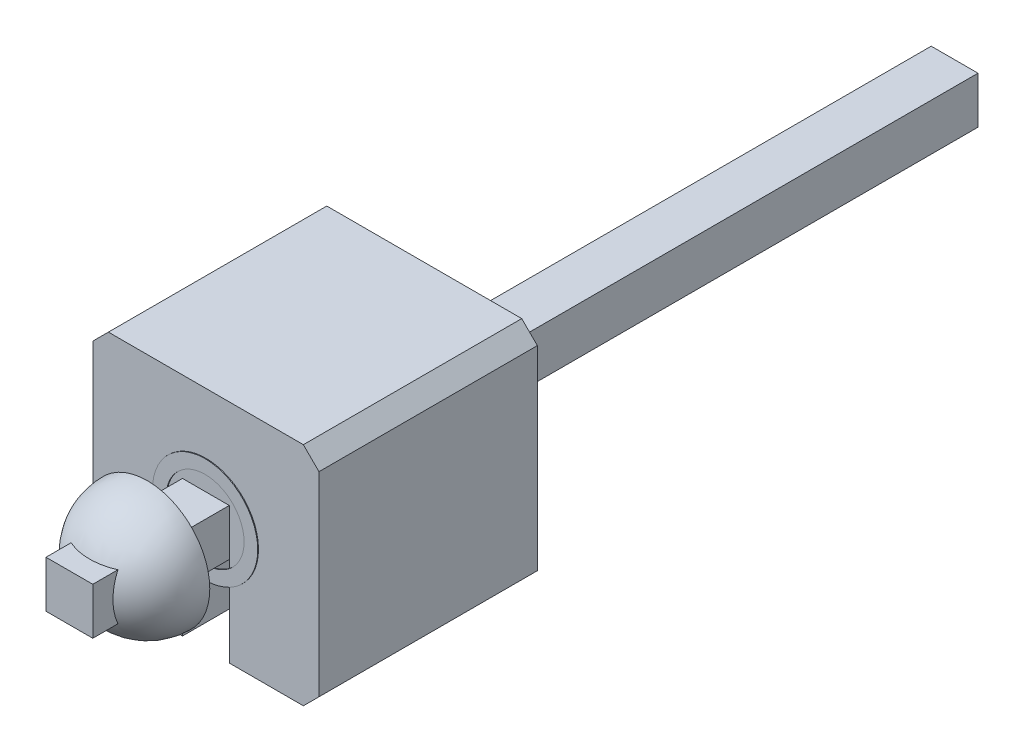
ISO-10303-21;
HEADER;
FILE_DESCRIPTION(('STEP AP214'),'2;1');
FILE_NAME('part.step','',(''),(''),'','','');
FILE_SCHEMA(('AUTOMOTIVE_DESIGN { 1 0 10303 214 1 1 1 1 }'));
ENDSEC;
DATA;
#1=APPLICATION_CONTEXT('core data for automotive mechanical design processes');
#2=APPLICATION_PROTOCOL_DEFINITION('international standard','automotive_design',2000,#1);
#3=PRODUCT_CONTEXT('',#1,'mechanical');
#4=PRODUCT('Part','Part','',(#3));
#5=PRODUCT_RELATED_PRODUCT_CATEGORY('part','',(#4));
#6=PRODUCT_DEFINITION_FORMATION('','',#4);
#7=PRODUCT_DEFINITION_CONTEXT('part definition',#1,'design');
#8=PRODUCT_DEFINITION('design','',#6,#7);
#9=PRODUCT_DEFINITION_SHAPE('','',#8);
#10=(LENGTH_UNIT() NAMED_UNIT(*) SI_UNIT(.MILLI.,.METRE.));
#11=(NAMED_UNIT(*) PLANE_ANGLE_UNIT() SI_UNIT($,.RADIAN.));
#12=(NAMED_UNIT(*) SI_UNIT($,.STERADIAN.) SOLID_ANGLE_UNIT());
#13=UNCERTAINTY_MEASURE_WITH_UNIT(LENGTH_MEASURE(1.E-05),#10,'distance_accuracy_value','');
#14=(GEOMETRIC_REPRESENTATION_CONTEXT(3) GLOBAL_UNCERTAINTY_ASSIGNED_CONTEXT((#13)) GLOBAL_UNIT_ASSIGNED_CONTEXT((#10,
#11,#12)) REPRESENTATION_CONTEXT('',''));
#15=CARTESIAN_POINT('',(0.,0.,0.));
#16=DIRECTION('',(0.,0.,1.));
#17=DIRECTION('',(1.,0.,0.));
#18=AXIS2_PLACEMENT_3D('',#15,#16,#17);
#19=CARTESIAN_POINT('',(0.,0.,2.8));
#20=DIRECTION('',(0.,0.,-1.));
#21=DIRECTION('',(-1.,0.,0.));
#22=AXIS2_PLACEMENT_3D('',#19,#20,#21);
#23=PLANE('',#22);
#24=DIRECTION('',(0.,1.,0.));
#25=VECTOR('',#24,1.);
#26=CARTESIAN_POINT('',(0.3,0.3,2.8));
#27=LINE('',#26,#25);
#28=CARTESIAN_POINT('',(0.3,-0.4,2.8));
#29=VERTEX_POINT('',#28);
#30=CARTESIAN_POINT('',(0.3,-0.3,2.8));
#31=VERTEX_POINT('',#30);
#32=EDGE_CURVE('E325',#29,#31,#27,.T.);
#33=ORIENTED_EDGE('',*,*,#32,.F.);
#34=CARTESIAN_POINT('',(0.,0.,2.8));
#35=DIRECTION('',(0.,0.,1.));
#36=DIRECTION('',(1.,0.,0.));
#37=AXIS2_PLACEMENT_3D('',#34,#35,#36);
#38=CIRCLE('',#37,0.5);
#39=CARTESIAN_POINT('',(-0.3,-0.4,2.8));
#40=VERTEX_POINT('',#39);
#41=EDGE_CURVE('E257',#29,#40,#38,.T.);
#42=ORIENTED_EDGE('',*,*,#41,.T.);
#43=DIRECTION('',(0.,-1.,0.));
#44=VECTOR('',#43,1.);
#45=CARTESIAN_POINT('',(-0.3,0.3,2.8));
#46=LINE('',#45,#44);
#47=CARTESIAN_POINT('',(-0.3,-0.3,2.8));
#48=VERTEX_POINT('',#47);
#49=EDGE_CURVE('E331',#48,#40,#46,.T.);
#50=ORIENTED_EDGE('',*,*,#49,.F.);
#51=CARTESIAN_POINT('',(-0.3,0.3,2.8));
#52=VERTEX_POINT('',#51);
#53=EDGE_CURVE('E328',#52,#48,#46,.T.);
#54=ORIENTED_EDGE('',*,*,#53,.F.);
#55=DIRECTION('',(-1.,0.,0.));
#56=VECTOR('',#55,1.);
#57=CARTESIAN_POINT('',(-0.3,0.3,2.8));
#58=LINE('',#57,#56);
#59=CARTESIAN_POINT('',(0.3,0.3,2.8));
#60=VERTEX_POINT('',#59);
#61=EDGE_CURVE('E324',#60,#52,#58,.T.);
#62=ORIENTED_EDGE('',*,*,#61,.F.);
#63=DIRECTION('',(0.,-1.,0.));
#64=VECTOR('',#63,1.);
#65=CARTESIAN_POINT('',(0.3,0.,2.8));
#66=LINE('',#65,#64);
#67=EDGE_CURVE('E288',#60,#31,#66,.T.);
#68=ORIENTED_EDGE('',*,*,#67,.T.);
#69=EDGE_LOOP('',(#33,#42,#50,#54,#62,#68));
#70=FACE_BOUND('',#69,.T.);
#71=ADVANCED_FACE('F34',(#70),#23,.F.);
#72=CARTESIAN_POINT('',(0.,0.,2.8));
#73=DIRECTION('',(0.,0.,1.));
#74=DIRECTION('',(1.,0.,0.));
#75=AXIS2_PLACEMENT_3D('',#72,#73,#74);
#76=CIRCLE('',#75,0.674645204944682);
#77=CARTESIAN_POINT('',(0.3,-0.604273243288872,2.8));
#78=VERTEX_POINT('',#77);
#79=CARTESIAN_POINT('',(-0.3,-0.604273243288872,2.8));
#80=VERTEX_POINT('',#79);
#81=EDGE_CURVE('E261',#78,#80,#76,.T.);
#82=ORIENTED_EDGE('',*,*,#81,.F.);
#83=CARTESIAN_POINT('',(0.3,-1.45,2.8));
#84=VERTEX_POINT('',#83);
#85=EDGE_CURVE('E321',#84,#78,#27,.T.);
#86=ORIENTED_EDGE('',*,*,#85,.F.);
#87=DIRECTION('',(1.,0.,0.));
#88=VECTOR('',#87,1.);
#89=CARTESIAN_POINT('',(1.25,-1.45,2.8));
#90=LINE('',#89,#88);
#91=CARTESIAN_POINT('',(1.25,-1.45,2.8));
#92=VERTEX_POINT('',#91);
#93=EDGE_CURVE('E353',#84,#92,#90,.T.);
#94=ORIENTED_EDGE('',*,*,#93,.T.);
#95=DIRECTION('',(0.707106781186548,0.707106781186548,0.));
#96=VECTOR('',#95,1.);
#97=CARTESIAN_POINT('',(1.45,-1.25,2.8));
#98=LINE('',#97,#96);
#99=CARTESIAN_POINT('',(1.45,-1.25,2.8));
#100=VERTEX_POINT('',#99);
#101=EDGE_CURVE('E357',#92,#100,#98,.T.);
#102=ORIENTED_EDGE('',*,*,#101,.T.);
#103=DIRECTION('',(0.,1.,0.));
#104=VECTOR('',#103,1.);
#105=CARTESIAN_POINT('',(1.45,-1.25,2.8));
#106=LINE('',#105,#104);
#107=CARTESIAN_POINT('',(1.45,1.25,2.8));
#108=VERTEX_POINT('',#107);
#109=EDGE_CURVE('E359',#100,#108,#106,.T.);
#110=ORIENTED_EDGE('',*,*,#109,.T.);
#111=DIRECTION('',(-0.707106781186548,0.707106781186548,0.));
#112=VECTOR('',#111,1.);
#113=CARTESIAN_POINT('',(1.45,1.25,2.8));
#114=LINE('',#113,#112);
#115=CARTESIAN_POINT('',(1.25,1.45,2.8));
#116=VERTEX_POINT('',#115);
#117=EDGE_CURVE('E361',#108,#116,#114,.T.);
#118=ORIENTED_EDGE('',*,*,#117,.T.);
#119=DIRECTION('',(-1.,0.,0.));
#120=VECTOR('',#119,1.);
#121=CARTESIAN_POINT('',(1.25,1.45,2.8));
#122=LINE('',#121,#120);
#123=CARTESIAN_POINT('',(-1.25,1.45,2.8));
#124=VERTEX_POINT('',#123);
#125=EDGE_CURVE('E343',#116,#124,#122,.T.);
#126=ORIENTED_EDGE('',*,*,#125,.T.);
#127=DIRECTION('',(-0.707106781186547,-0.707106781186548,0.));
#128=VECTOR('',#127,1.);
#129=CARTESIAN_POINT('',(-1.25,1.45,2.8));
#130=LINE('',#129,#128);
#131=CARTESIAN_POINT('',(-1.45,1.25,2.8));
#132=VERTEX_POINT('',#131);
#133=EDGE_CURVE('E346',#124,#132,#130,.T.);
#134=ORIENTED_EDGE('',*,*,#133,.T.);
#135=DIRECTION('',(0.,-1.,0.));
#136=VECTOR('',#135,1.);
#137=CARTESIAN_POINT('',(-1.45,-1.25,2.8));
#138=LINE('',#137,#136);
#139=CARTESIAN_POINT('',(-1.45,-1.25,2.8));
#140=VERTEX_POINT('',#139);
#141=EDGE_CURVE('E349',#132,#140,#138,.T.);
#142=ORIENTED_EDGE('',*,*,#141,.T.);
#143=DIRECTION('',(0.707106781186548,-0.707106781186548,0.));
#144=VECTOR('',#143,1.);
#145=CARTESIAN_POINT('',(-1.25,-1.45,2.8));
#146=LINE('',#145,#144);
#147=CARTESIAN_POINT('',(-1.25,-1.45,2.8));
#148=VERTEX_POINT('',#147);
#149=EDGE_CURVE('E351',#140,#148,#146,.T.);
#150=ORIENTED_EDGE('',*,*,#149,.T.);
#151=CARTESIAN_POINT('',(-0.3,-1.45,2.8));
#152=VERTEX_POINT('',#151);
#153=EDGE_CURVE('E354',#148,#152,#90,.T.);
#154=ORIENTED_EDGE('',*,*,#153,.T.);
#155=EDGE_CURVE('E327',#80,#152,#46,.T.);
#156=ORIENTED_EDGE('',*,*,#155,.F.);
#157=EDGE_LOOP('',(#82,#86,#94,#102,#110,#118,#126,#134,#142,#150,#154,#156));
#158=FACE_BOUND('',#157,.T.);
#159=ADVANCED_FACE('F478',(#158),#23,.F.);
#160=CARTESIAN_POINT('',(0.,0.,0.));
#161=DIRECTION('',(0.,0.,-1.));
#162=DIRECTION('',(-1.,0.,0.));
#163=AXIS2_PLACEMENT_3D('',#160,#161,#162);
#164=PLANE('',#163);
#165=DIRECTION('',(-1.,0.,0.));
#166=VECTOR('',#165,1.);
#167=CARTESIAN_POINT('',(1.25,1.45,0.));
#168=LINE('',#167,#166);
#169=CARTESIAN_POINT('',(1.25,1.45,0.));
#170=VERTEX_POINT('',#169);
#171=CARTESIAN_POINT('',(-1.25,1.45,0.));
#172=VERTEX_POINT('',#171);
#173=EDGE_CURVE('E330',#170,#172,#168,.T.);
#174=ORIENTED_EDGE('',*,*,#173,.F.);
#175=DIRECTION('',(-0.707106781186548,0.707106781186548,0.));
#176=VECTOR('',#175,1.);
#177=CARTESIAN_POINT('',(1.45,1.25,0.));
#178=LINE('',#177,#176);
#179=CARTESIAN_POINT('',(1.45,1.25,0.));
#180=VERTEX_POINT('',#179);
#181=EDGE_CURVE('E347',#180,#170,#178,.T.);
#182=ORIENTED_EDGE('',*,*,#181,.F.);
#183=DIRECTION('',(0.,1.,0.));
#184=VECTOR('',#183,1.);
#185=CARTESIAN_POINT('',(1.45,-1.25,0.));
#186=LINE('',#185,#184);
#187=CARTESIAN_POINT('',(1.45,-1.25,0.));
#188=VERTEX_POINT('',#187);
#189=EDGE_CURVE('E376',#188,#180,#186,.T.);
#190=ORIENTED_EDGE('',*,*,#189,.F.);
#191=DIRECTION('',(0.707106781186548,0.707106781186548,0.));
#192=VECTOR('',#191,1.);
#193=CARTESIAN_POINT('',(1.45,-1.25,0.));
#194=LINE('',#193,#192);
#195=CARTESIAN_POINT('',(1.25,-1.45,0.));
#196=VERTEX_POINT('',#195);
#197=EDGE_CURVE('E374',#196,#188,#194,.T.);
#198=ORIENTED_EDGE('',*,*,#197,.F.);
#199=DIRECTION('',(1.,0.,0.));
#200=VECTOR('',#199,1.);
#201=CARTESIAN_POINT('',(1.25,-1.45,0.));
#202=LINE('',#201,#200);
#203=CARTESIAN_POINT('',(-1.25,-1.45,0.));
#204=VERTEX_POINT('',#203);
#205=EDGE_CURVE('E372',#204,#196,#202,.T.);
#206=ORIENTED_EDGE('',*,*,#205,.F.);
#207=DIRECTION('',(0.707106781186548,-0.707106781186548,0.));
#208=VECTOR('',#207,1.);
#209=CARTESIAN_POINT('',(-1.25,-1.45,0.));
#210=LINE('',#209,#208);
#211=CARTESIAN_POINT('',(-1.45,-1.25,0.));
#212=VERTEX_POINT('',#211);
#213=EDGE_CURVE('E370',#212,#204,#210,.T.);
#214=ORIENTED_EDGE('',*,*,#213,.F.);
#215=DIRECTION('',(0.,-1.,0.));
#216=VECTOR('',#215,1.);
#217=CARTESIAN_POINT('',(-1.45,-1.25,0.));
#218=LINE('',#217,#216);
#219=CARTESIAN_POINT('',(-1.45,1.25,0.));
#220=VERTEX_POINT('',#219);
#221=EDGE_CURVE('E368',#220,#212,#218,.T.);
#222=ORIENTED_EDGE('',*,*,#221,.F.);
#223=DIRECTION('',(-0.707106781186547,-0.707106781186548,0.));
#224=VECTOR('',#223,1.);
#225=CARTESIAN_POINT('',(-1.25,1.45,0.));
#226=LINE('',#225,#224);
#227=EDGE_CURVE('E366',#172,#220,#226,.T.);
#228=ORIENTED_EDGE('',*,*,#227,.F.);
#229=EDGE_LOOP('',(#174,#182,#190,#198,#206,#214,#222,#228));
#230=FACE_BOUND('',#229,.T.);
#231=DIRECTION('',(1.,0.,0.));
#232=VECTOR('',#231,1.);
#233=CARTESIAN_POINT('',(-0.3,-0.3,0.));
#234=LINE('',#233,#232);
#235=CARTESIAN_POINT('',(-0.3,-0.3,0.));
#236=VERTEX_POINT('',#235);
#237=CARTESIAN_POINT('',(0.3,-0.3,0.));
#238=VERTEX_POINT('',#237);
#239=EDGE_CURVE('E340',#236,#238,#234,.T.);
#240=ORIENTED_EDGE('',*,*,#239,.T.);
#241=DIRECTION('',(0.,1.,0.));
#242=VECTOR('',#241,1.);
#243=CARTESIAN_POINT('',(0.3,0.3,0.));
#244=LINE('',#243,#242);
#245=CARTESIAN_POINT('',(0.3,0.3,0.));
#246=VERTEX_POINT('',#245);
#247=EDGE_CURVE('E318',#238,#246,#244,.T.);
#248=ORIENTED_EDGE('',*,*,#247,.T.);
#249=DIRECTION('',(-1.,0.,0.));
#250=VECTOR('',#249,1.);
#251=CARTESIAN_POINT('',(-0.3,0.3,0.));
#252=LINE('',#251,#250);
#253=CARTESIAN_POINT('',(-0.3,0.3,0.));
#254=VERTEX_POINT('',#253);
#255=EDGE_CURVE('E334',#246,#254,#252,.T.);
#256=ORIENTED_EDGE('',*,*,#255,.T.);
#257=DIRECTION('',(0.,-1.,0.));
#258=VECTOR('',#257,1.);
#259=CARTESIAN_POINT('',(-0.3,0.3,0.));
#260=LINE('',#259,#258);
#261=EDGE_CURVE('E337',#254,#236,#260,.T.);
#262=ORIENTED_EDGE('',*,*,#261,.T.);
#263=EDGE_LOOP('',(#240,#248,#256,#262));
#264=FACE_BOUND('',#263,.T.);
#265=ADVANCED_FACE('F454',(#230,#264),#164,.T.);
#266=CARTESIAN_POINT('',(1.25,1.45,2.8));
#267=DIRECTION('',(0.,-1.,0.));
#268=DIRECTION('',(1.,0.,0.));
#269=AXIS2_PLACEMENT_3D('',#266,#267,#268);
#270=PLANE('',#269);
#271=ORIENTED_EDGE('',*,*,#173,.T.);
#272=DIRECTION('',(0.,0.,-1.));
#273=VECTOR('',#272,1.);
#274=CARTESIAN_POINT('',(-1.25,1.45,2.8));
#275=LINE('',#274,#273);
#276=EDGE_CURVE('E399',#124,#172,#275,.T.);
#277=ORIENTED_EDGE('',*,*,#276,.F.);
#278=ORIENTED_EDGE('',*,*,#125,.F.);
#279=DIRECTION('',(0.,0.,-1.));
#280=VECTOR('',#279,1.);
#281=CARTESIAN_POINT('',(1.25,1.45,2.8));
#282=LINE('',#281,#280);
#283=EDGE_CURVE('E363',#116,#170,#282,.T.);
#284=ORIENTED_EDGE('',*,*,#283,.T.);
#285=EDGE_LOOP('',(#271,#277,#278,#284));
#286=FACE_BOUND('',#285,.T.);
#287=ADVANCED_FACE('F492',(#286),#270,.F.);
#288=CARTESIAN_POINT('',(-1.25,1.45,2.8));
#289=DIRECTION('',(0.707106781186548,-0.707106781186547,0.));
#290=DIRECTION('',(0.707106781186547,0.707106781186548,0.));
#291=AXIS2_PLACEMENT_3D('',#288,#289,#290);
#292=PLANE('',#291);
#293=ORIENTED_EDGE('',*,*,#227,.T.);
#294=DIRECTION('',(0.,0.,-1.));
#295=VECTOR('',#294,1.);
#296=CARTESIAN_POINT('',(-1.45,1.25,2.8));
#297=LINE('',#296,#295);
#298=EDGE_CURVE('E396',#132,#220,#297,.T.);
#299=ORIENTED_EDGE('',*,*,#298,.F.);
#300=ORIENTED_EDGE('',*,*,#133,.F.);
#301=ORIENTED_EDGE('',*,*,#276,.T.);
#302=EDGE_LOOP('',(#293,#299,#300,#301));
#303=FACE_BOUND('',#302,.T.);
#304=ADVANCED_FACE('F517',(#303),#292,.F.);
#305=CARTESIAN_POINT('',(-1.45,-1.25,2.8));
#306=DIRECTION('',(1.,0.,0.));
#307=DIRECTION('',(0.,0.,-1.));
#308=AXIS2_PLACEMENT_3D('',#305,#306,#307);
#309=PLANE('',#308);
#310=ORIENTED_EDGE('',*,*,#221,.T.);
#311=DIRECTION('',(0.,0.,-1.));
#312=VECTOR('',#311,1.);
#313=CARTESIAN_POINT('',(-1.45,-1.25,2.8));
#314=LINE('',#313,#312);
#315=EDGE_CURVE('E393',#140,#212,#314,.T.);
#316=ORIENTED_EDGE('',*,*,#315,.F.);
#317=ORIENTED_EDGE('',*,*,#141,.F.);
#318=ORIENTED_EDGE('',*,*,#298,.T.);
#319=EDGE_LOOP('',(#310,#316,#317,#318));
#320=FACE_BOUND('',#319,.T.);
#321=ADVANCED_FACE('F513',(#320),#309,.F.);
#322=CARTESIAN_POINT('',(-1.25,-1.45,2.8));
#323=DIRECTION('',(0.707106781186547,0.707106781186547,0.));
#324=DIRECTION('',(-0.707106781186548,0.707106781186548,0.));
#325=AXIS2_PLACEMENT_3D('',#322,#323,#324);
#326=PLANE('',#325);
#327=ORIENTED_EDGE('',*,*,#213,.T.);
#328=DIRECTION('',(0.,0.,-1.));
#329=VECTOR('',#328,1.);
#330=CARTESIAN_POINT('',(-1.25,-1.45,2.8));
#331=LINE('',#330,#329);
#332=EDGE_CURVE('E390',#148,#204,#331,.T.);
#333=ORIENTED_EDGE('',*,*,#332,.F.);
#334=ORIENTED_EDGE('',*,*,#149,.F.);
#335=ORIENTED_EDGE('',*,*,#315,.T.);
#336=EDGE_LOOP('',(#327,#333,#334,#335));
#337=FACE_BOUND('',#336,.T.);
#338=ADVANCED_FACE('F509',(#337),#326,.F.);
#339=CARTESIAN_POINT('',(1.25,-1.45,2.8));
#340=DIRECTION('',(0.,1.,0.));
#341=DIRECTION('',(-1.,0.,0.));
#342=AXIS2_PLACEMENT_3D('',#339,#340,#341);
#343=PLANE('',#342);
#344=DIRECTION('',(1.,0.,0.));
#345=VECTOR('',#344,1.);
#346=CARTESIAN_POINT('',(-0.3,-1.45,1.8));
#347=LINE('',#346,#345);
#348=CARTESIAN_POINT('',(-0.3,-1.45,1.8));
#349=VERTEX_POINT('',#348);
#350=CARTESIAN_POINT('',(0.3,-1.45,1.8));
#351=VERTEX_POINT('',#350);
#352=EDGE_CURVE('E305',#349,#351,#347,.T.);
#353=ORIENTED_EDGE('',*,*,#352,.F.);
#354=DIRECTION('',(0.,0.,1.));
#355=VECTOR('',#354,1.);
#356=CARTESIAN_POINT('',(-0.3,-1.45,1.8));
#357=LINE('',#356,#355);
#358=EDGE_CURVE('E314',#349,#152,#357,.T.);
#359=ORIENTED_EDGE('',*,*,#358,.T.);
#360=ORIENTED_EDGE('',*,*,#153,.F.);
#361=ORIENTED_EDGE('',*,*,#332,.T.);
#362=ORIENTED_EDGE('',*,*,#205,.T.);
#363=DIRECTION('',(0.,0.,-1.));
#364=VECTOR('',#363,1.);
#365=CARTESIAN_POINT('',(1.25,-1.45,2.8));
#366=LINE('',#365,#364);
#367=EDGE_CURVE('E387',#92,#196,#366,.T.);
#368=ORIENTED_EDGE('',*,*,#367,.F.);
#369=ORIENTED_EDGE('',*,*,#93,.F.);
#370=DIRECTION('',(0.,0.,1.));
#371=VECTOR('',#370,1.);
#372=CARTESIAN_POINT('',(0.3,-1.45,1.8));
#373=LINE('',#372,#371);
#374=EDGE_CURVE('E315',#351,#84,#373,.T.);
#375=ORIENTED_EDGE('',*,*,#374,.F.);
#376=EDGE_LOOP('',(#353,#359,#360,#361,#362,#368,#369,#375));
#377=FACE_BOUND('',#376,.T.);
#378=ADVANCED_FACE('F505',(#377),#343,.F.);
#379=CARTESIAN_POINT('',(1.45,-1.25,2.8));
#380=DIRECTION('',(-0.707106781186547,0.707106781186547,0.));
#381=DIRECTION('',(-0.707106781186548,-0.707106781186548,0.));
#382=AXIS2_PLACEMENT_3D('',#379,#380,#381);
#383=PLANE('',#382);
#384=ORIENTED_EDGE('',*,*,#197,.T.);
#385=DIRECTION('',(0.,0.,-1.));
#386=VECTOR('',#385,1.);
#387=CARTESIAN_POINT('',(1.45,-1.25,2.8));
#388=LINE('',#387,#386);
#389=EDGE_CURVE('E384',#100,#188,#388,.T.);
#390=ORIENTED_EDGE('',*,*,#389,.F.);
#391=ORIENTED_EDGE('',*,*,#101,.F.);
#392=ORIENTED_EDGE('',*,*,#367,.T.);
#393=EDGE_LOOP('',(#384,#390,#391,#392));
#394=FACE_BOUND('',#393,.T.);
#395=ADVANCED_FACE('F501',(#394),#383,.F.);
#396=CARTESIAN_POINT('',(1.45,-1.25,2.8));
#397=DIRECTION('',(-1.,0.,0.));
#398=DIRECTION('',(0.,0.,1.));
#399=AXIS2_PLACEMENT_3D('',#396,#397,#398);
#400=PLANE('',#399);
#401=ORIENTED_EDGE('',*,*,#189,.T.);
#402=DIRECTION('',(0.,0.,-1.));
#403=VECTOR('',#402,1.);
#404=CARTESIAN_POINT('',(1.45,1.25,2.8));
#405=LINE('',#404,#403);
#406=EDGE_CURVE('E381',#108,#180,#405,.T.);
#407=ORIENTED_EDGE('',*,*,#406,.F.);
#408=ORIENTED_EDGE('',*,*,#109,.F.);
#409=ORIENTED_EDGE('',*,*,#389,.T.);
#410=EDGE_LOOP('',(#401,#407,#408,#409));
#411=FACE_BOUND('',#410,.T.);
#412=ADVANCED_FACE('F497',(#411),#400,.F.);
#413=CARTESIAN_POINT('',(1.45,1.25,2.8));
#414=DIRECTION('',(-0.707106781186547,-0.707106781186547,0.));
#415=DIRECTION('',(0.707106781186548,-0.707106781186548,0.));
#416=AXIS2_PLACEMENT_3D('',#413,#414,#415);
#417=PLANE('',#416);
#418=ORIENTED_EDGE('',*,*,#181,.T.);
#419=ORIENTED_EDGE('',*,*,#283,.F.);
#420=ORIENTED_EDGE('',*,*,#117,.F.);
#421=ORIENTED_EDGE('',*,*,#406,.T.);
#422=EDGE_LOOP('',(#418,#419,#420,#421));
#423=FACE_BOUND('',#422,.T.);
#424=ADVANCED_FACE('F494',(#423),#417,.F.);
#425=CARTESIAN_POINT('',(0.3,0.3,2.8));
#426=DIRECTION('',(-1.,0.,0.));
#427=DIRECTION('',(0.,-1.,0.));
#428=AXIS2_PLACEMENT_3D('',#425,#426,#427);
#429=PLANE('',#428);
#430=DIRECTION('',(0.,0.,1.));
#431=VECTOR('',#430,1.);
#432=CARTESIAN_POINT('',(0.3,-0.3,-7.));
#433=LINE('',#432,#431);
#434=CARTESIAN_POINT('',(0.3,-0.3,1.8));
#435=VERTEX_POINT('',#434);
#436=EDGE_CURVE('E289',#435,#31,#433,.T.);
#437=ORIENTED_EDGE('',*,*,#436,.F.);
#438=DIRECTION('',(0.,1.,0.));
#439=VECTOR('',#438,1.);
#440=CARTESIAN_POINT('',(0.3,-0.3,1.8));
#441=LINE('',#440,#439);
#442=EDGE_CURVE('E308',#351,#435,#441,.T.);
#443=ORIENTED_EDGE('',*,*,#442,.F.);
#444=ORIENTED_EDGE('',*,*,#374,.T.);
#445=ORIENTED_EDGE('',*,*,#85,.T.);
#446=DIRECTION('',(0.,1.,0.));
#447=VECTOR('',#446,1.);
#448=CARTESIAN_POINT('',(0.3,0.3,2.8));
#449=LINE('',#448,#447);
#450=EDGE_CURVE('E268',#78,#29,#449,.T.);
#451=ORIENTED_EDGE('',*,*,#450,.T.);
#452=ORIENTED_EDGE('',*,*,#32,.T.);
#453=EDGE_LOOP('',(#437,#443,#444,#445,#451,#452));
#454=FACE_BOUND('',#453,.T.);
#455=ADVANCED_FACE('F488',(#454),#429,.T.);
#456=CARTESIAN_POINT('',(-0.3,0.3,2.8));
#457=DIRECTION('',(1.,0.,0.));
#458=DIRECTION('',(0.,1.,0.));
#459=AXIS2_PLACEMENT_3D('',#456,#457,#458);
#460=PLANE('',#459);
#461=DIRECTION('',(0.,0.,1.));
#462=VECTOR('',#461,1.);
#463=CARTESIAN_POINT('',(-0.3,-0.3,-7.));
#464=LINE('',#463,#462);
#465=CARTESIAN_POINT('',(-0.3,-0.3,1.8));
#466=VERTEX_POINT('',#465);
#467=EDGE_CURVE('E293',#466,#48,#464,.T.);
#468=ORIENTED_EDGE('',*,*,#467,.T.);
#469=ORIENTED_EDGE('',*,*,#49,.T.);
#470=EDGE_CURVE('E768',#40,#80,#46,.T.);
#471=ORIENTED_EDGE('',*,*,#470,.T.);
#472=ORIENTED_EDGE('',*,*,#155,.T.);
#473=ORIENTED_EDGE('',*,*,#358,.F.);
#474=DIRECTION('',(0.,-1.,0.));
#475=VECTOR('',#474,1.);
#476=CARTESIAN_POINT('',(-0.3,-0.3,1.8));
#477=LINE('',#476,#475);
#478=EDGE_CURVE('E302',#466,#349,#477,.T.);
#479=ORIENTED_EDGE('',*,*,#478,.F.);
#480=EDGE_LOOP('',(#468,#469,#471,#472,#473,#479));
#481=FACE_BOUND('',#480,.T.);
#482=ADVANCED_FACE('F675',(#481),#460,.T.);
#483=CARTESIAN_POINT('',(0.,0.,1.8));
#484=DIRECTION('',(0.,0.,1.));
#485=DIRECTION('',(1.,0.,0.));
#486=AXIS2_PLACEMENT_3D('',#483,#484,#485);
#487=PLANE('',#486);
#488=ORIENTED_EDGE('',*,*,#478,.T.);
#489=ORIENTED_EDGE('',*,*,#352,.T.);
#490=ORIENTED_EDGE('',*,*,#442,.T.);
#491=DIRECTION('',(-1.,0.,0.));
#492=VECTOR('',#491,1.);
#493=CARTESIAN_POINT('',(-0.3,-0.3,1.8));
#494=LINE('',#493,#492);
#495=EDGE_CURVE('E311',#435,#466,#494,.T.);
#496=ORIENTED_EDGE('',*,*,#495,.T.);
#497=EDGE_LOOP('',(#488,#489,#490,#496));
#498=FACE_BOUND('',#497,.T.);
#499=ADVANCED_FACE('F670',(#498),#487,.T.);
#500=CARTESIAN_POINT('',(0.3,0.3,-7.));
#501=DIRECTION('',(0.,1.,0.));
#502=DIRECTION('',(0.,0.,1.));
#503=AXIS2_PLACEMENT_3D('',#500,#501,#502);
#504=PLANE('',#503);
#505=ORIENTED_EDGE('',*,*,#61,.T.);
#506=DIRECTION('',(0.,0.,1.));
#507=VECTOR('',#506,1.);
#508=CARTESIAN_POINT('',(-0.3,0.3,-7.));
#509=LINE('',#508,#507);
#510=CARTESIAN_POINT('',(-0.3,0.3,3.55));
#511=VERTEX_POINT('',#510);
#512=EDGE_CURVE('E297',#52,#511,#509,.T.);
#513=ORIENTED_EDGE('',*,*,#512,.T.);
#514=DIRECTION('',(-1.,0.,0.));
#515=VECTOR('',#514,1.);
#516=CARTESIAN_POINT('',(0.3,0.3,3.55));
#517=LINE('',#516,#515);
#518=CARTESIAN_POINT('',(0.3,0.3,3.55));
#519=VERTEX_POINT('',#518);
#520=EDGE_CURVE('E276',#519,#511,#517,.T.);
#521=ORIENTED_EDGE('',*,*,#520,.F.);
#522=DIRECTION('',(0.,0.,1.));
#523=VECTOR('',#522,1.);
#524=CARTESIAN_POINT('',(0.3,0.3,-7.));
#525=LINE('',#524,#523);
#526=EDGE_CURVE('E285',#60,#519,#525,.T.);
#527=ORIENTED_EDGE('',*,*,#526,.F.);
#528=EDGE_LOOP('',(#505,#513,#521,#527));
#529=FACE_BOUND('',#528,.T.);
#530=ADVANCED_FACE('F475',(#529),#504,.T.);
#531=CARTESIAN_POINT('',(0.3,-0.3,-7.));
#532=DIRECTION('',(0.,-1.,0.));
#533=DIRECTION('',(0.,0.,-1.));
#534=AXIS2_PLACEMENT_3D('',#531,#532,#533);
#535=PLANE('',#534);
#536=ORIENTED_EDGE('',*,*,#467,.F.);
#537=ORIENTED_EDGE('',*,*,#495,.F.);
#538=ORIENTED_EDGE('',*,*,#436,.T.);
#539=CARTESIAN_POINT('',(0.3,-0.3,3.55));
#540=VERTEX_POINT('',#539);
#541=EDGE_CURVE('E290',#31,#540,#433,.T.);
#542=ORIENTED_EDGE('',*,*,#541,.T.);
#543=DIRECTION('',(1.,0.,0.));
#544=VECTOR('',#543,1.);
#545=CARTESIAN_POINT('',(0.3,-0.3,3.55));
#546=LINE('',#545,#544);
#547=CARTESIAN_POINT('',(-0.3,-0.3,3.55));
#548=VERTEX_POINT('',#547);
#549=EDGE_CURVE('E282',#548,#540,#546,.T.);
#550=ORIENTED_EDGE('',*,*,#549,.F.);
#551=EDGE_CURVE('E294',#48,#548,#464,.T.);
#552=ORIENTED_EDGE('',*,*,#551,.F.);
#553=EDGE_LOOP('',(#536,#537,#538,#542,#550,#552));
#554=FACE_BOUND('',#553,.T.);
#555=ADVANCED_FACE('F464',(#554),#535,.T.);
#556=CARTESIAN_POINT('',(-0.3,0.3,-7.));
#557=DIRECTION('',(-1.,0.,0.));
#558=DIRECTION('',(0.,-1.,0.));
#559=AXIS2_PLACEMENT_3D('',#556,#557,#558);
#560=PLANE('',#559);
#561=ORIENTED_EDGE('',*,*,#53,.T.);
#562=ORIENTED_EDGE('',*,*,#551,.T.);
#563=DIRECTION('',(0.,-1.,0.));
#564=VECTOR('',#563,1.);
#565=CARTESIAN_POINT('',(-0.3,0.3,3.55));
#566=LINE('',#565,#564);
#567=EDGE_CURVE('E279',#511,#548,#566,.T.);
#568=ORIENTED_EDGE('',*,*,#567,.F.);
#569=ORIENTED_EDGE('',*,*,#512,.F.);
#570=EDGE_LOOP('',(#561,#562,#568,#569));
#571=FACE_BOUND('',#570,.T.);
#572=ADVANCED_FACE('F470',(#571),#560,.T.);
#573=CARTESIAN_POINT('',(0.3,-0.3,-7.));
#574=DIRECTION('',(1.,0.,0.));
#575=DIRECTION('',(0.,1.,0.));
#576=AXIS2_PLACEMENT_3D('',#573,#574,#575);
#577=PLANE('',#576);
#578=ORIENTED_EDGE('',*,*,#67,.F.);
#579=ORIENTED_EDGE('',*,*,#526,.T.);
#580=DIRECTION('',(0.,1.,0.));
#581=VECTOR('',#580,1.);
#582=CARTESIAN_POINT('',(0.3,-0.3,3.55));
#583=LINE('',#582,#581);
#584=EDGE_CURVE('E273',#540,#519,#583,.T.);
#585=ORIENTED_EDGE('',*,*,#584,.F.);
#586=ORIENTED_EDGE('',*,*,#541,.F.);
#587=EDGE_LOOP('',(#578,#579,#585,#586));
#588=FACE_BOUND('',#587,.T.);
#589=ADVANCED_FACE('F462',(#588),#577,.T.);
#590=CARTESIAN_POINT('',(-0.3,-0.3,-6.8));
#591=VERTEX_POINT('',#590);
#592=EDGE_CURVE('E291',#591,#236,#464,.T.);
#593=ORIENTED_EDGE('',*,*,#592,.F.);
#594=DIRECTION('',(1.,0.,0.));
#595=VECTOR('',#594,1.);
#596=CARTESIAN_POINT('',(0.3,-0.3,-6.8));
#597=LINE('',#596,#595);
#598=CARTESIAN_POINT('',(0.3,-0.3,-6.8));
#599=VERTEX_POINT('',#598);
#600=EDGE_CURVE('E43',#591,#599,#597,.T.);
#601=ORIENTED_EDGE('',*,*,#600,.T.);
#602=EDGE_CURVE('E286',#599,#238,#433,.T.);
#603=ORIENTED_EDGE('',*,*,#602,.T.);
#604=ORIENTED_EDGE('',*,*,#239,.F.);
#605=EDGE_LOOP('',(#593,#601,#603,#604));
#606=FACE_BOUND('',#605,.T.);
#607=ADVANCED_FACE('F460',(#606),#535,.T.);
#608=ORIENTED_EDGE('',*,*,#602,.F.);
#609=DIRECTION('',(0.,1.,0.));
#610=VECTOR('',#609,1.);
#611=CARTESIAN_POINT('',(0.3,0.3,-6.8));
#612=LINE('',#611,#610);
#613=CARTESIAN_POINT('',(0.3,0.3,-6.8));
#614=VERTEX_POINT('',#613);
#615=EDGE_CURVE('E11',#599,#614,#612,.T.);
#616=ORIENTED_EDGE('',*,*,#615,.T.);
#617=EDGE_CURVE('E298',#614,#246,#525,.T.);
#618=ORIENTED_EDGE('',*,*,#617,.T.);
#619=ORIENTED_EDGE('',*,*,#247,.F.);
#620=EDGE_LOOP('',(#608,#616,#618,#619));
#621=FACE_BOUND('',#620,.T.);
#622=ADVANCED_FACE('F458',(#621),#577,.T.);
#623=CARTESIAN_POINT('',(-0.3,0.3,-6.8));
#624=VERTEX_POINT('',#623);
#625=EDGE_CURVE('E295',#624,#254,#509,.T.);
#626=ORIENTED_EDGE('',*,*,#625,.F.);
#627=DIRECTION('',(0.,-1.,0.));
#628=VECTOR('',#627,1.);
#629=CARTESIAN_POINT('',(-0.3,-0.3,-6.8));
#630=LINE('',#629,#628);
#631=EDGE_CURVE('E414',#624,#591,#630,.T.);
#632=ORIENTED_EDGE('',*,*,#631,.T.);
#633=ORIENTED_EDGE('',*,*,#592,.T.);
#634=ORIENTED_EDGE('',*,*,#261,.F.);
#635=EDGE_LOOP('',(#626,#632,#633,#634));
#636=FACE_BOUND('',#635,.T.);
#637=ADVANCED_FACE('F451',(#636),#560,.T.);
#638=ORIENTED_EDGE('',*,*,#617,.F.);
#639=DIRECTION('',(-1.,0.,0.));
#640=VECTOR('',#639,1.);
#641=CARTESIAN_POINT('',(-0.3,0.3,-6.8));
#642=LINE('',#641,#640);
#643=EDGE_CURVE('E402',#614,#624,#642,.T.);
#644=ORIENTED_EDGE('',*,*,#643,.T.);
#645=ORIENTED_EDGE('',*,*,#625,.T.);
#646=ORIENTED_EDGE('',*,*,#255,.F.);
#647=EDGE_LOOP('',(#638,#644,#645,#646));
#648=FACE_BOUND('',#647,.T.);
#649=ADVANCED_FACE('F448',(#648),#504,.T.);
#650=CARTESIAN_POINT('',(0.,0.,-7.));
#651=DIRECTION('',(0.,0.,1.));
#652=DIRECTION('',(1.,0.,0.));
#653=AXIS2_PLACEMENT_3D('',#650,#651,#652);
#654=PLANE('',#653);
#655=DIRECTION('',(0.,1.,0.));
#656=VECTOR('',#655,1.);
#657=CARTESIAN_POINT('',(-0.0999999999999995,0.3,-7.));
#658=LINE('',#657,#656);
#659=CARTESIAN_POINT('',(-0.0999999999999994,-0.0999999999999994,-7.));
#660=VERTEX_POINT('',#659);
#661=CARTESIAN_POINT('',(-0.0999999999999995,0.0999999999999995,-7.));
#662=VERTEX_POINT('',#661);
#663=EDGE_CURVE('E409',#660,#662,#658,.T.);
#664=ORIENTED_EDGE('',*,*,#663,.T.);
#665=DIRECTION('',(1.,0.,0.));
#666=VECTOR('',#665,1.);
#667=CARTESIAN_POINT('',(0.3,0.0999999999999995,-7.));
#668=LINE('',#667,#666);
#669=CARTESIAN_POINT('',(0.0999999999999994,0.0999999999999995,-7.));
#670=VERTEX_POINT('',#669);
#671=EDGE_CURVE('E411',#662,#670,#668,.T.);
#672=ORIENTED_EDGE('',*,*,#671,.T.);
#673=DIRECTION('',(0.,-1.,0.));
#674=VECTOR('',#673,1.);
#675=CARTESIAN_POINT('',(0.0999999999999995,-0.3,-7.));
#676=LINE('',#675,#674);
#677=CARTESIAN_POINT('',(0.0999999999999995,-0.0999999999999994,-7.));
#678=VERTEX_POINT('',#677);
#679=EDGE_CURVE('E405',#670,#678,#676,.T.);
#680=ORIENTED_EDGE('',*,*,#679,.T.);
#681=DIRECTION('',(-1.,0.,0.));
#682=VECTOR('',#681,1.);
#683=CARTESIAN_POINT('',(-0.3,-0.0999999999999994,-7.));
#684=LINE('',#683,#682);
#685=EDGE_CURVE('E407',#678,#660,#684,.T.);
#686=ORIENTED_EDGE('',*,*,#685,.T.);
#687=EDGE_LOOP('',(#664,#672,#680,#686));
#688=FACE_BOUND('',#687,.T.);
#689=ADVANCED_FACE('F436',(#688),#654,.F.);
#690=CARTESIAN_POINT('',(0.3,-0.3,-6.8));
#691=DIRECTION('',(0.,-0.707106781186547,-0.707106781186547));
#692=DIRECTION('',(-1.,0.,0.));
#693=AXIS2_PLACEMENT_3D('',#690,#691,#692);
#694=PLANE('',#693);
#695=DIRECTION('',(0.577350269189626,0.577350269189626,-0.577350269189626));
#696=VECTOR('',#695,1.);
#697=CARTESIAN_POINT('',(-0.0999999999999999,-0.1,-7.));
#698=LINE('',#697,#696);
#699=EDGE_CURVE('E419',#660,#591,#698,.F.);
#700=ORIENTED_EDGE('',*,*,#699,.F.);
#701=ORIENTED_EDGE('',*,*,#685,.F.);
#702=DIRECTION('',(-0.577350269189626,0.577350269189626,-0.577350269189626));
#703=VECTOR('',#702,1.);
#704=CARTESIAN_POINT('',(0.3,-0.3,-6.8));
#705=LINE('',#704,#703);
#706=EDGE_CURVE('E38',#599,#678,#705,.T.);
#707=ORIENTED_EDGE('',*,*,#706,.F.);
#708=ORIENTED_EDGE('',*,*,#600,.F.);
#709=EDGE_LOOP('',(#700,#701,#707,#708));
#710=FACE_BOUND('',#709,.T.);
#711=ADVANCED_FACE('F36',(#710),#694,.T.);
#712=CARTESIAN_POINT('',(0.3,-0.3,-6.8));
#713=DIRECTION('',(0.707106781186547,0.,-0.707106781186547));
#714=DIRECTION('',(0.,-1.,0.));
#715=AXIS2_PLACEMENT_3D('',#712,#713,#714);
#716=PLANE('',#715);
#717=ORIENTED_EDGE('',*,*,#706,.T.);
#718=ORIENTED_EDGE('',*,*,#679,.F.);
#719=DIRECTION('',(0.577350269189626,0.577350269189626,0.577350269189626));
#720=VECTOR('',#719,1.);
#721=CARTESIAN_POINT('',(0.1,0.1,-7.));
#722=LINE('',#721,#720);
#723=EDGE_CURVE('E418',#614,#670,#722,.F.);
#724=ORIENTED_EDGE('',*,*,#723,.F.);
#725=ORIENTED_EDGE('',*,*,#615,.F.);
#726=EDGE_LOOP('',(#717,#718,#724,#725));
#727=FACE_BOUND('',#726,.T.);
#728=ADVANCED_FACE('F430',(#727),#716,.T.);
#729=CARTESIAN_POINT('',(-0.3,0.3,-6.8));
#730=DIRECTION('',(-0.707106781186547,0.,-0.707106781186547));
#731=DIRECTION('',(0.,1.,0.));
#732=AXIS2_PLACEMENT_3D('',#729,#730,#731);
#733=PLANE('',#732);
#734=ORIENTED_EDGE('',*,*,#699,.T.);
#735=ORIENTED_EDGE('',*,*,#631,.F.);
#736=DIRECTION('',(0.577350269189626,-0.577350269189626,-0.577350269189626));
#737=VECTOR('',#736,1.);
#738=CARTESIAN_POINT('',(-0.3,0.3,-6.8));
#739=LINE('',#738,#737);
#740=EDGE_CURVE('E272',#662,#624,#739,.F.);
#741=ORIENTED_EDGE('',*,*,#740,.F.);
#742=ORIENTED_EDGE('',*,*,#663,.F.);
#743=EDGE_LOOP('',(#734,#735,#741,#742));
#744=FACE_BOUND('',#743,.T.);
#745=ADVANCED_FACE('F442',(#744),#733,.T.);
#746=CARTESIAN_POINT('',(0.3,0.3,-6.8));
#747=DIRECTION('',(0.,0.707106781186547,-0.707106781186547));
#748=DIRECTION('',(1.,0.,0.));
#749=AXIS2_PLACEMENT_3D('',#746,#747,#748);
#750=PLANE('',#749);
#751=ORIENTED_EDGE('',*,*,#723,.T.);
#752=ORIENTED_EDGE('',*,*,#671,.F.);
#753=ORIENTED_EDGE('',*,*,#740,.T.);
#754=ORIENTED_EDGE('',*,*,#643,.F.);
#755=EDGE_LOOP('',(#751,#752,#753,#754));
#756=FACE_BOUND('',#755,.T.);
#757=ADVANCED_FACE('F440',(#756),#750,.T.);
#758=CARTESIAN_POINT('',(0.,0.,2.81));
#759=DIRECTION('',(0.,0.,1.));
#760=DIRECTION('',(1.,0.,0.));
#761=AXIS2_PLACEMENT_3D('',#758,#759,#760);
#762=PLANE('',#761);
#763=CARTESIAN_POINT('',(0.,0.,2.81));
#764=DIRECTION('',(0.,0.,1.));
#765=DIRECTION('',(1.,0.,0.));
#766=AXIS2_PLACEMENT_3D('',#763,#764,#765);
#767=CIRCLE('',#766,0.674645204944682);
#768=CARTESIAN_POINT('',(0.674645204944682,0.,2.81));
#769=VERTEX_POINT('',#768);
#770=EDGE_CURVE('E265',#769,#769,#767,.T.);
#771=ORIENTED_EDGE('',*,*,#770,.T.);
#772=EDGE_LOOP('',(#771));
#773=FACE_BOUND('',#772,.T.);
#774=CARTESIAN_POINT('',(0.,0.,2.81));
#775=DIRECTION('',(0.,0.,1.));
#776=DIRECTION('',(1.,0.,0.));
#777=AXIS2_PLACEMENT_3D('',#774,#775,#776);
#778=CIRCLE('',#777,0.5);
#779=CARTESIAN_POINT('',(0.5,0.,2.81));
#780=VERTEX_POINT('',#779);
#781=EDGE_CURVE('E258',#780,#780,#778,.T.);
#782=ORIENTED_EDGE('',*,*,#781,.F.);
#783=EDGE_LOOP('',(#782));
#784=FACE_BOUND('',#783,.T.);
#785=ADVANCED_FACE('F527',(#773,#784),#762,.T.);
#786=CARTESIAN_POINT('',(0.,0.,2.8));
#787=DIRECTION('',(0.,0.,1.));
#788=DIRECTION('',(1.,0.,0.));
#789=AXIS2_PLACEMENT_3D('',#786,#787,#788);
#790=PLANE('',#789);
#791=ORIENTED_EDGE('',*,*,#450,.F.);
#792=EDGE_CURVE('E59',#80,#78,#76,.T.);
#793=ORIENTED_EDGE('',*,*,#792,.F.);
#794=ORIENTED_EDGE('',*,*,#470,.F.);
#795=EDGE_CURVE('E262',#40,#29,#38,.T.);
#796=ORIENTED_EDGE('',*,*,#795,.T.);
#797=EDGE_LOOP('',(#791,#793,#794,#796));
#798=FACE_BOUND('',#797,.T.);
#799=ADVANCED_FACE('F545',(#798),#790,.F.);
#800=CARTESIAN_POINT('',(0.,0.,2.81));
#801=DIRECTION('',(0.,0.,-1.));
#802=DIRECTION('',(-1.,0.,0.));
#803=AXIS2_PLACEMENT_3D('',#800,#801,#802);
#804=CYLINDRICAL_SURFACE('',#803,0.674645204944682);
#805=ORIENTED_EDGE('',*,*,#770,.F.);
#806=EDGE_LOOP('',(#805));
#807=FACE_BOUND('',#806,.T.);
#808=ORIENTED_EDGE('',*,*,#792,.T.);
#809=ORIENTED_EDGE('',*,*,#81,.T.);
#810=EDGE_LOOP('',(#808,#809));
#811=FACE_BOUND('',#810,.T.);
#812=ADVANCED_FACE('F541',(#807,#811),#804,.T.);
#813=CARTESIAN_POINT('',(0.,0.,2.81));
#814=DIRECTION('',(0.,0.,-1.));
#815=DIRECTION('',(-1.,0.,0.));
#816=AXIS2_PLACEMENT_3D('',#813,#814,#815);
#817=CYLINDRICAL_SURFACE('',#816,0.5);
#818=ORIENTED_EDGE('',*,*,#781,.T.);
#819=EDGE_LOOP('',(#818));
#820=FACE_BOUND('',#819,.T.);
#821=ORIENTED_EDGE('',*,*,#795,.F.);
#822=ORIENTED_EDGE('',*,*,#41,.F.);
#823=EDGE_LOOP('',(#821,#822));
#824=FACE_BOUND('',#823,.T.);
#825=ADVANCED_FACE('F544',(#820,#824),#817,.F.);
#826=CARTESIAN_POINT('',(0.,0.,3.55));
#827=DIRECTION('',(-1.,0.,0.));
#828=DIRECTION('',(0.,-1.,0.));
#829=AXIS2_PLACEMENT_3D('',#826,#827,#828);
#830=SPHERICAL_SURFACE('',#829,0.8);
#831=CARTESIAN_POINT('',(-0.3,0.,3.55));
#832=DIRECTION('',(-1.,0.,0.));
#833=DIRECTION('',(0.,-1.,0.));
#834=AXIS2_PLACEMENT_3D('',#831,#832,#833);
#835=CIRCLE('',#834,0.741619848709566);
#836=CARTESIAN_POINT('',(-0.3,-0.300000000000005,4.22823299831252));
#837=VERTEX_POINT('',#836);
#838=CARTESIAN_POINT('',(-0.3,0.299999999999995,4.22823299831253));
#839=VERTEX_POINT('',#838);
#840=EDGE_CURVE('E249',#837,#839,#835,.T.);
#841=ORIENTED_EDGE('',*,*,#840,.T.);
#842=CARTESIAN_POINT('',(0.,0.3,3.55));
#843=DIRECTION('',(0.,1.,0.));
#844=DIRECTION('',(0.,0.,1.));
#845=AXIS2_PLACEMENT_3D('',#842,#843,#844);
#846=CIRCLE('',#845,0.741619848709566);
#847=CARTESIAN_POINT('',(0.3,0.299999999999995,4.22823299831253));
#848=VERTEX_POINT('',#847);
#849=EDGE_CURVE('E252',#839,#848,#846,.T.);
#850=ORIENTED_EDGE('',*,*,#849,.T.);
#851=CARTESIAN_POINT('',(0.3,0.,3.55));
#852=DIRECTION('',(1.,0.,0.));
#853=DIRECTION('',(0.,1.,0.));
#854=AXIS2_PLACEMENT_3D('',#851,#852,#853);
#855=CIRCLE('',#854,0.741619848709566);
#856=CARTESIAN_POINT('',(0.3,-0.300000000000005,4.22823299831252));
#857=VERTEX_POINT('',#856);
#858=EDGE_CURVE('E217',#848,#857,#855,.T.);
#859=ORIENTED_EDGE('',*,*,#858,.T.);
#860=CARTESIAN_POINT('',(0.,-0.3,3.55));
#861=DIRECTION('',(0.,-1.,0.));
#862=DIRECTION('',(0.,0.,-1.));
#863=AXIS2_PLACEMENT_3D('',#860,#861,#862);
#864=CIRCLE('',#863,0.741619848709566);
#865=EDGE_CURVE('E246',#857,#837,#864,.T.);
#866=ORIENTED_EDGE('',*,*,#865,.T.);
#867=EDGE_LOOP('',(#841,#850,#859,#866));
#868=FACE_BOUND('',#867,.T.);
#869=CARTESIAN_POINT('',(0.,0.,3.55));
#870=DIRECTION('',(0.,0.,-1.));
#871=DIRECTION('',(1.,0.,0.));
#872=AXIS2_PLACEMENT_3D('',#869,#870,#871);
#873=CIRCLE('',#872,0.8);
#874=CARTESIAN_POINT('',(0.8,0.,3.55));
#875=VERTEX_POINT('',#874);
#876=EDGE_CURVE('E254',#875,#875,#873,.T.);
#877=ORIENTED_EDGE('',*,*,#876,.F.);
#878=EDGE_LOOP('',(#877));
#879=FACE_BOUND('',#878,.T.);
#880=ADVANCED_FACE('F554',(#868,#879),#830,.T.);
#881=CARTESIAN_POINT('',(0.,0.,3.55));
#882=DIRECTION('',(0.,0.,-1.));
#883=DIRECTION('',(1.,0.,0.));
#884=AXIS2_PLACEMENT_3D('',#881,#882,#883);
#885=PLANE('',#884);
#886=ORIENTED_EDGE('',*,*,#520,.T.);
#887=ORIENTED_EDGE('',*,*,#567,.T.);
#888=ORIENTED_EDGE('',*,*,#549,.T.);
#889=ORIENTED_EDGE('',*,*,#584,.T.);
#890=EDGE_LOOP('',(#886,#887,#888,#889));
#891=FACE_BOUND('',#890,.T.);
#892=ORIENTED_EDGE('',*,*,#876,.T.);
#893=EDGE_LOOP('',(#892));
#894=FACE_BOUND('',#893,.T.);
#895=ADVANCED_FACE('F558',(#891,#894),#885,.T.);
#896=CARTESIAN_POINT('',(0.3,0.299999999999993,4.55));
#897=DIRECTION('',(0.,1.,0.));
#898=DIRECTION('',(0.,0.,1.));
#899=AXIS2_PLACEMENT_3D('',#896,#897,#898);
#900=PLANE('',#899);
#901=ORIENTED_EDGE('',*,*,#849,.F.);
#902=DIRECTION('',(0.,0.,-1.));
#903=VECTOR('',#902,1.);
#904=CARTESIAN_POINT('',(-0.3,0.299999999999993,4.55));
#905=LINE('',#904,#903);
#906=CARTESIAN_POINT('',(-0.3,0.299999999999993,4.55));
#907=VERTEX_POINT('',#906);
#908=EDGE_CURVE('E235',#907,#839,#905,.T.);
#909=ORIENTED_EDGE('',*,*,#908,.F.);
#910=DIRECTION('',(1.,0.,0.));
#911=VECTOR('',#910,1.);
#912=CARTESIAN_POINT('',(0.3,0.299999999999993,4.55));
#913=LINE('',#912,#911);
#914=CARTESIAN_POINT('',(0.3,0.299999999999993,4.55));
#915=VERTEX_POINT('',#914);
#916=EDGE_CURVE('E228',#907,#915,#913,.T.);
#917=ORIENTED_EDGE('',*,*,#916,.T.);
#918=DIRECTION('',(0.,0.,-1.));
#919=VECTOR('',#918,1.);
#920=CARTESIAN_POINT('',(0.3,0.299999999999993,4.55));
#921=LINE('',#920,#919);
#922=EDGE_CURVE('E212',#915,#848,#921,.T.);
#923=ORIENTED_EDGE('',*,*,#922,.T.);
#924=EDGE_LOOP('',(#901,#909,#917,#923));
#925=FACE_BOUND('',#924,.T.);
#926=ADVANCED_FACE('F233',(#925),#900,.T.);
#927=CARTESIAN_POINT('',(-0.3,0.299999999999993,4.55));
#928=DIRECTION('',(-1.,0.,0.));
#929=DIRECTION('',(0.,-1.,0.));
#930=AXIS2_PLACEMENT_3D('',#927,#928,#929);
#931=PLANE('',#930);
#932=ORIENTED_EDGE('',*,*,#840,.F.);
#933=DIRECTION('',(0.,0.,-1.));
#934=VECTOR('',#933,1.);
#935=CARTESIAN_POINT('',(-0.3,-0.300000000000007,4.55));
#936=LINE('',#935,#934);
#937=CARTESIAN_POINT('',(-0.3,-0.300000000000007,4.55));
#938=VERTEX_POINT('',#937);
#939=EDGE_CURVE('E241',#938,#837,#936,.T.);
#940=ORIENTED_EDGE('',*,*,#939,.F.);
#941=DIRECTION('',(0.,1.,0.));
#942=VECTOR('',#941,1.);
#943=CARTESIAN_POINT('',(-0.3,0.299999999999993,4.55));
#944=LINE('',#943,#942);
#945=EDGE_CURVE('E221',#938,#907,#944,.T.);
#946=ORIENTED_EDGE('',*,*,#945,.T.);
#947=ORIENTED_EDGE('',*,*,#908,.T.);
#948=EDGE_LOOP('',(#932,#940,#946,#947));
#949=FACE_BOUND('',#948,.T.);
#950=ADVANCED_FACE('F565',(#949),#931,.T.);
#951=CARTESIAN_POINT('',(-0.3,-0.300000000000007,4.55));
#952=DIRECTION('',(0.,-1.,0.));
#953=DIRECTION('',(0.,0.,-1.));
#954=AXIS2_PLACEMENT_3D('',#951,#952,#953);
#955=PLANE('',#954);
#956=ORIENTED_EDGE('',*,*,#865,.F.);
#957=DIRECTION('',(0.,0.,-1.));
#958=VECTOR('',#957,1.);
#959=CARTESIAN_POINT('',(0.3,-0.300000000000007,4.55));
#960=LINE('',#959,#958);
#961=CARTESIAN_POINT('',(0.3,-0.300000000000007,4.55));
#962=VERTEX_POINT('',#961);
#963=EDGE_CURVE('E51',#962,#857,#960,.T.);
#964=ORIENTED_EDGE('',*,*,#963,.F.);
#965=DIRECTION('',(-1.,0.,0.));
#966=VECTOR('',#965,1.);
#967=CARTESIAN_POINT('',(-0.3,-0.300000000000007,4.55));
#968=LINE('',#967,#966);
#969=EDGE_CURVE('E231',#962,#938,#968,.T.);
#970=ORIENTED_EDGE('',*,*,#969,.T.);
#971=ORIENTED_EDGE('',*,*,#939,.T.);
#972=EDGE_LOOP('',(#956,#964,#970,#971));
#973=FACE_BOUND('',#972,.T.);
#974=ADVANCED_FACE('F568',(#973),#955,.T.);
#975=CARTESIAN_POINT('',(0.3,-0.300000000000007,4.55));
#976=DIRECTION('',(1.,0.,0.));
#977=DIRECTION('',(0.,1.,0.));
#978=AXIS2_PLACEMENT_3D('',#975,#976,#977);
#979=PLANE('',#978);
#980=ORIENTED_EDGE('',*,*,#858,.F.);
#981=ORIENTED_EDGE('',*,*,#922,.F.);
#982=DIRECTION('',(0.,-1.,0.));
#983=VECTOR('',#982,1.);
#984=CARTESIAN_POINT('',(0.3,-0.300000000000007,4.55));
#985=LINE('',#984,#983);
#986=EDGE_CURVE('E215',#915,#962,#985,.T.);
#987=ORIENTED_EDGE('',*,*,#986,.T.);
#988=ORIENTED_EDGE('',*,*,#963,.T.);
#989=EDGE_LOOP('',(#980,#981,#987,#988));
#990=FACE_BOUND('',#989,.T.);
#991=ADVANCED_FACE('F214',(#990),#979,.T.);
#992=CARTESIAN_POINT('',(0.,0.,4.55));
#993=DIRECTION('',(0.,0.,1.));
#994=DIRECTION('',(0.,-1.,0.));
#995=AXIS2_PLACEMENT_3D('',#992,#993,#994);
#996=PLANE('',#995);
#997=ORIENTED_EDGE('',*,*,#916,.F.);
#998=ORIENTED_EDGE('',*,*,#945,.F.);
#999=ORIENTED_EDGE('',*,*,#969,.F.);
#1000=ORIENTED_EDGE('',*,*,#986,.F.);
#1001=EDGE_LOOP('',(#997,#998,#999,#1000));
#1002=FACE_BOUND('',#1001,.T.);
#1003=ADVANCED_FACE('F226',(#1002),#996,.T.);
#1004=CLOSED_SHELL('',(#71,#159,#265,#287,#304,#321,#338,#378,#395,#412,#424,#455,#482,#499,
#530,#555,#572,#589,#607,#622,#637,#649,#689,#711,#728,#745,#757,#785,#799,#812,#825,#880,#895,
#926,#950,#974,#991,#1003));
#1005=MANIFOLD_SOLID_BREP('B2',#1004);
#1006=ADVANCED_BREP_SHAPE_REPRESENTATION('',(#18,#1005),#14);
#1007=SHAPE_DEFINITION_REPRESENTATION(#9,#1006);
ENDSEC;
END-ISO-10303-21;
